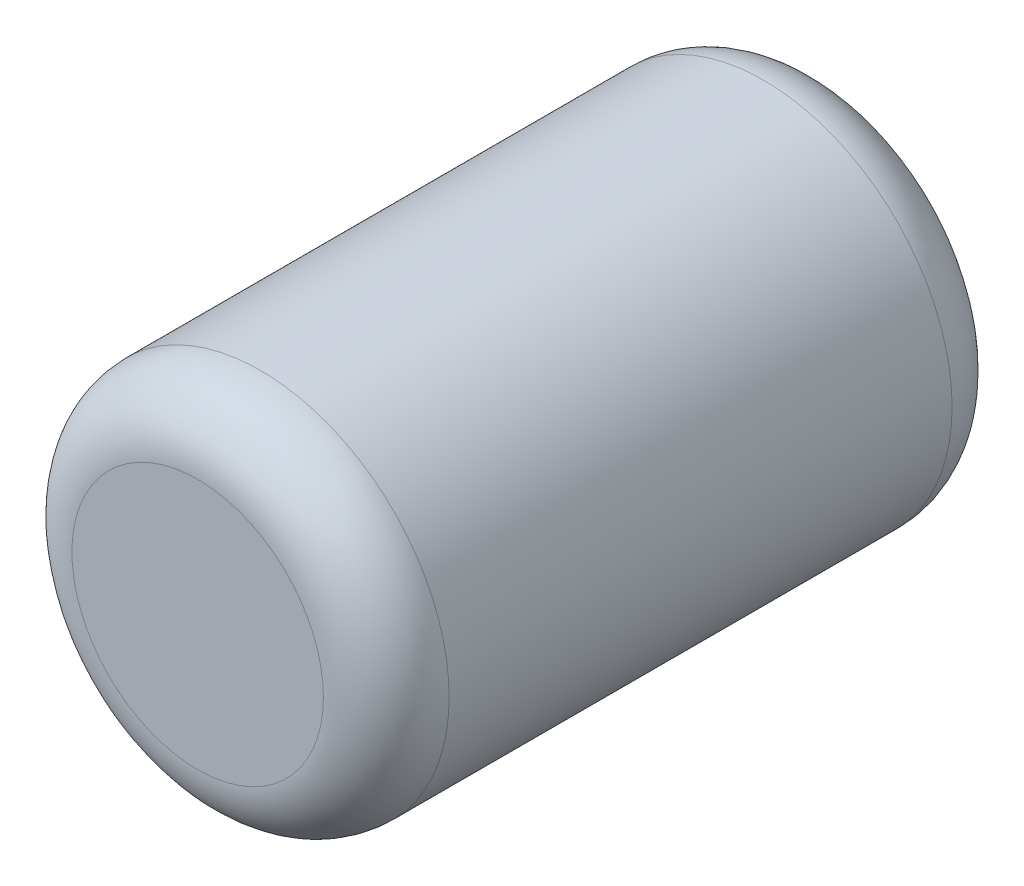
ISO-10303-21;
HEADER;
FILE_DESCRIPTION(('STEP AP214'),'2;1');
FILE_NAME('part.step','',(''),(''),'','','');
FILE_SCHEMA(('AUTOMOTIVE_DESIGN { 1 0 10303 214 1 1 1 1 }'));
ENDSEC;
DATA;
#1=APPLICATION_CONTEXT('core data for automotive mechanical design processes');
#2=APPLICATION_PROTOCOL_DEFINITION('international standard','automotive_design',2000,#1);
#3=PRODUCT_CONTEXT('',#1,'mechanical');
#4=PRODUCT('Part','Part','',(#3));
#5=PRODUCT_RELATED_PRODUCT_CATEGORY('part','',(#4));
#6=PRODUCT_DEFINITION_FORMATION('','',#4);
#7=PRODUCT_DEFINITION_CONTEXT('part definition',#1,'design');
#8=PRODUCT_DEFINITION('design','',#6,#7);
#9=PRODUCT_DEFINITION_SHAPE('','',#8);
#10=(LENGTH_UNIT() NAMED_UNIT(*) SI_UNIT(.MILLI.,.METRE.));
#11=(NAMED_UNIT(*) PLANE_ANGLE_UNIT() SI_UNIT($,.RADIAN.));
#12=(NAMED_UNIT(*) SI_UNIT($,.STERADIAN.) SOLID_ANGLE_UNIT());
#13=UNCERTAINTY_MEASURE_WITH_UNIT(LENGTH_MEASURE(1.E-05),#10,'distance_accuracy_value','');
#14=(GEOMETRIC_REPRESENTATION_CONTEXT(3) GLOBAL_UNCERTAINTY_ASSIGNED_CONTEXT((#13)) GLOBAL_UNIT_ASSIGNED_CONTEXT((#10,
#11,#12)) REPRESENTATION_CONTEXT('',''));
#15=CARTESIAN_POINT('',(0.,0.,0.));
#16=DIRECTION('',(0.,0.,1.));
#17=DIRECTION('',(1.,0.,0.));
#18=AXIS2_PLACEMENT_3D('',#15,#16,#17);
#19=CARTESIAN_POINT('',(0.,0.,5.));
#20=DIRECTION('',(0.,0.,-1.));
#21=DIRECTION('',(-1.,0.,0.));
#22=AXIS2_PLACEMENT_3D('',#19,#20,#21);
#23=CYLINDRICAL_SURFACE('',#22,1.5);
#24=CARTESIAN_POINT('',(0.,0.,0.5));
#25=DIRECTION('',(0.,0.,1.));
#26=DIRECTION('',(1.,0.,0.));
#27=AXIS2_PLACEMENT_3D('',#24,#25,#26);
#28=CIRCLE('',#27,1.5);
#29=CARTESIAN_POINT('',(1.5,0.,0.5));
#30=VERTEX_POINT('',#29);
#31=EDGE_CURVE('E40',#30,#30,#28,.T.);
#32=ORIENTED_EDGE('',*,*,#31,.T.);
#33=EDGE_LOOP('',(#32));
#34=FACE_BOUND('',#33,.T.);
#35=CARTESIAN_POINT('',(0.,0.,4.5));
#36=DIRECTION('',(0.,0.,1.));
#37=DIRECTION('',(1.,0.,0.));
#38=AXIS2_PLACEMENT_3D('',#35,#36,#37);
#39=CIRCLE('',#38,1.5);
#40=CARTESIAN_POINT('',(1.5,0.,4.5));
#41=VERTEX_POINT('',#40);
#42=EDGE_CURVE('E44',#41,#41,#39,.F.);
#43=ORIENTED_EDGE('',*,*,#42,.T.);
#44=EDGE_LOOP('',(#43));
#45=FACE_BOUND('',#44,.T.);
#46=ADVANCED_FACE('F29',(#34,#45),#23,.T.);
#47=CARTESIAN_POINT('',(0.,0.,5.));
#48=DIRECTION('',(0.,0.,1.));
#49=DIRECTION('',(1.,0.,0.));
#50=AXIS2_PLACEMENT_3D('',#47,#48,#49);
#51=PLANE('',#50);
#52=CARTESIAN_POINT('',(0.,0.,5.));
#53=DIRECTION('',(0.,0.,1.));
#54=DIRECTION('',(1.,0.,0.));
#55=AXIS2_PLACEMENT_3D('',#52,#53,#54);
#56=CIRCLE('',#55,1.);
#57=CARTESIAN_POINT('',(1.,0.,5.));
#58=VERTEX_POINT('',#57);
#59=EDGE_CURVE('E10',#58,#58,#56,.T.);
#60=ORIENTED_EDGE('',*,*,#59,.T.);
#61=EDGE_LOOP('',(#60));
#62=FACE_BOUND('',#61,.T.);
#63=ADVANCED_FACE('F60',(#62),#51,.T.);
#64=CARTESIAN_POINT('',(0.,0.,0.));
#65=DIRECTION('',(0.,0.,1.));
#66=DIRECTION('',(1.,0.,0.));
#67=AXIS2_PLACEMENT_3D('',#64,#65,#66);
#68=PLANE('',#67);
#69=CARTESIAN_POINT('',(0.,0.,0.));
#70=DIRECTION('',(0.,0.,1.));
#71=DIRECTION('',(1.,0.,0.));
#72=AXIS2_PLACEMENT_3D('',#69,#70,#71);
#73=CIRCLE('',#72,1.);
#74=CARTESIAN_POINT('',(1.,0.,0.));
#75=VERTEX_POINT('',#74);
#76=EDGE_CURVE('E36',#75,#75,#73,.F.);
#77=ORIENTED_EDGE('',*,*,#76,.T.);
#78=EDGE_LOOP('',(#77));
#79=FACE_BOUND('',#78,.T.);
#80=ADVANCED_FACE('F57',(#79),#68,.F.);
#81=CARTESIAN_POINT('',(0.,0.,0.5));
#82=DIRECTION('',(0.,0.,1.));
#83=DIRECTION('',(1.,0.,0.));
#84=AXIS2_PLACEMENT_3D('',#81,#82,#83);
#85=TOROIDAL_SURFACE('',#84,1.,0.5);
#86=ORIENTED_EDGE('',*,*,#76,.F.);
#87=EDGE_LOOP('',(#86));
#88=FACE_BOUND('',#87,.T.);
#89=ORIENTED_EDGE('',*,*,#31,.F.);
#90=EDGE_LOOP('',(#89));
#91=FACE_BOUND('',#90,.T.);
#92=ADVANCED_FACE('F53',(#88,#91),#85,.T.);
#93=CARTESIAN_POINT('',(0.,0.,4.5));
#94=DIRECTION('',(0.,0.,1.));
#95=DIRECTION('',(1.,0.,0.));
#96=AXIS2_PLACEMENT_3D('',#93,#94,#95);
#97=TOROIDAL_SURFACE('',#96,1.,0.5);
#98=ORIENTED_EDGE('',*,*,#42,.F.);
#99=EDGE_LOOP('',(#98));
#100=FACE_BOUND('',#99,.T.);
#101=ORIENTED_EDGE('',*,*,#59,.F.);
#102=EDGE_LOOP('',(#101));
#103=FACE_BOUND('',#102,.T.);
#104=ADVANCED_FACE('F31',(#100,#103),#97,.T.);
#105=CLOSED_SHELL('',(#46,#63,#80,#92,#104));
#106=MANIFOLD_SOLID_BREP('B2',#105);
#107=ADVANCED_BREP_SHAPE_REPRESENTATION('',(#18,#106),#14);
#108=SHAPE_DEFINITION_REPRESENTATION(#9,#107);
ENDSEC;
END-ISO-10303-21;
